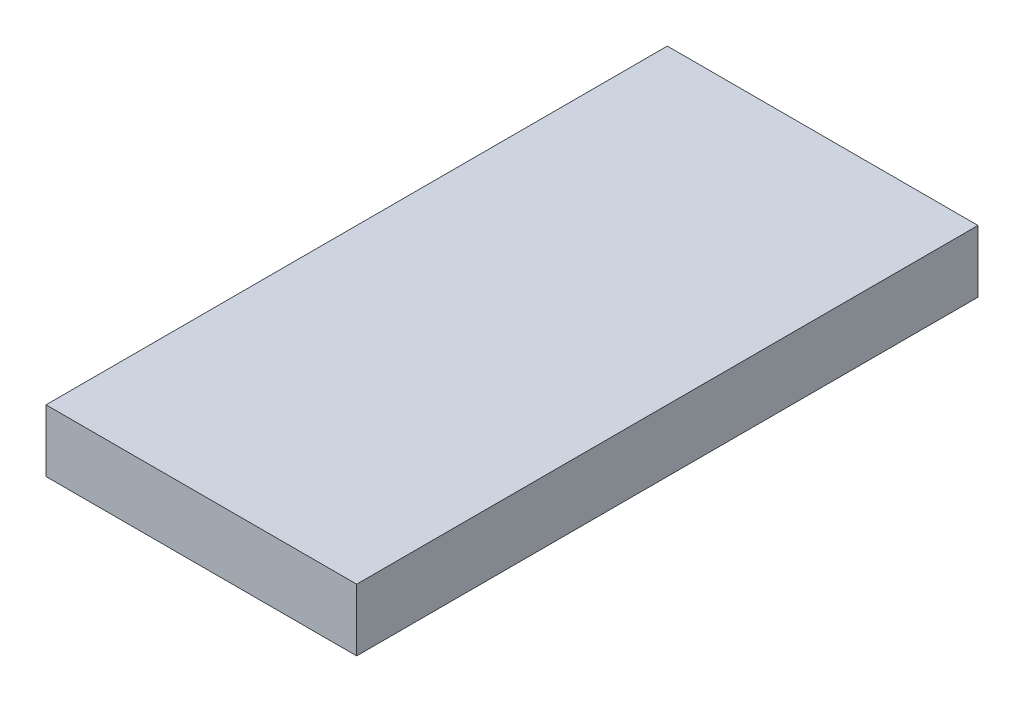
ISO-10303-21;
HEADER;
FILE_DESCRIPTION(('STEP AP214'),'2;1');
FILE_NAME('part.step','',(''),(''),'','','');
FILE_SCHEMA(('AUTOMOTIVE_DESIGN { 1 0 10303 214 1 1 1 1 }'));
ENDSEC;
DATA;
#1=APPLICATION_CONTEXT('core data for automotive mechanical design processes');
#2=APPLICATION_PROTOCOL_DEFINITION('international standard','automotive_design',2000,#1);
#3=PRODUCT_CONTEXT('',#1,'mechanical');
#4=PRODUCT('Part','Part','',(#3));
#5=PRODUCT_RELATED_PRODUCT_CATEGORY('part','',(#4));
#6=PRODUCT_DEFINITION_FORMATION('','',#4);
#7=PRODUCT_DEFINITION_CONTEXT('part definition',#1,'design');
#8=PRODUCT_DEFINITION('design','',#6,#7);
#9=PRODUCT_DEFINITION_SHAPE('','',#8);
#10=(LENGTH_UNIT() NAMED_UNIT(*) SI_UNIT(.MILLI.,.METRE.));
#11=(NAMED_UNIT(*) PLANE_ANGLE_UNIT() SI_UNIT($,.RADIAN.));
#12=(NAMED_UNIT(*) SI_UNIT($,.STERADIAN.) SOLID_ANGLE_UNIT());
#13=UNCERTAINTY_MEASURE_WITH_UNIT(LENGTH_MEASURE(1.E-05),#10,'distance_accuracy_value','');
#14=(GEOMETRIC_REPRESENTATION_CONTEXT(3) GLOBAL_UNCERTAINTY_ASSIGNED_CONTEXT((#13)) GLOBAL_UNIT_ASSIGNED_CONTEXT((#10,
#11,#12)) REPRESENTATION_CONTEXT('',''));
#15=CARTESIAN_POINT('',(0.,0.,0.));
#16=DIRECTION('',(0.,0.,1.));
#17=DIRECTION('',(1.,0.,0.));
#18=AXIS2_PLACEMENT_3D('',#15,#16,#17);
#19=CARTESIAN_POINT('',(10.,2.,20.));
#20=DIRECTION('',(-1.,0.,0.));
#21=DIRECTION('',(0.,0.,1.));
#22=AXIS2_PLACEMENT_3D('',#19,#20,#21);
#23=PLANE('',#22);
#24=DIRECTION('',(0.,0.,-1.));
#25=VECTOR('',#24,1.);
#26=CARTESIAN_POINT('',(10.,-2.,20.));
#27=LINE('',#26,#25);
#28=CARTESIAN_POINT('',(10.,-2.,20.));
#29=VERTEX_POINT('',#28);
#30=CARTESIAN_POINT('',(10.,-2.,-20.));
#31=VERTEX_POINT('',#30);
#32=EDGE_CURVE('E107',#29,#31,#27,.T.);
#33=ORIENTED_EDGE('',*,*,#32,.T.);
#34=DIRECTION('',(0.,-1.,0.));
#35=VECTOR('',#34,1.);
#36=CARTESIAN_POINT('',(10.,2.,-20.));
#37=LINE('',#36,#35);
#38=CARTESIAN_POINT('',(10.,2.,-20.));
#39=VERTEX_POINT('',#38);
#40=EDGE_CURVE('E11',#39,#31,#37,.T.);
#41=ORIENTED_EDGE('',*,*,#40,.F.);
#42=DIRECTION('',(0.,0.,-1.));
#43=VECTOR('',#42,1.);
#44=CARTESIAN_POINT('',(10.,2.,20.));
#45=LINE('',#44,#43);
#46=CARTESIAN_POINT('',(10.,2.,20.));
#47=VERTEX_POINT('',#46);
#48=EDGE_CURVE('E91',#47,#39,#45,.T.);
#49=ORIENTED_EDGE('',*,*,#48,.F.);
#50=DIRECTION('',(0.,-1.,0.));
#51=VECTOR('',#50,1.);
#52=CARTESIAN_POINT('',(10.,2.,20.));
#53=LINE('',#52,#51);
#54=EDGE_CURVE('E103',#47,#29,#53,.T.);
#55=ORIENTED_EDGE('',*,*,#54,.T.);
#56=EDGE_LOOP('',(#33,#41,#49,#55));
#57=FACE_BOUND('',#56,.T.);
#58=ADVANCED_FACE('F39',(#57),#23,.F.);
#59=CARTESIAN_POINT('',(-10.,2.,-20.));
#60=DIRECTION('',(0.,0.,1.));
#61=DIRECTION('',(1.,0.,0.));
#62=AXIS2_PLACEMENT_3D('',#59,#60,#61);
#63=PLANE('',#62);
#64=DIRECTION('',(-1.,0.,0.));
#65=VECTOR('',#64,1.);
#66=CARTESIAN_POINT('',(-10.,-2.,-20.));
#67=LINE('',#66,#65);
#68=CARTESIAN_POINT('',(-10.,-2.,-20.));
#69=VERTEX_POINT('',#68);
#70=EDGE_CURVE('E96',#31,#69,#67,.T.);
#71=ORIENTED_EDGE('',*,*,#70,.T.);
#72=DIRECTION('',(0.,-1.,0.));
#73=VECTOR('',#72,1.);
#74=CARTESIAN_POINT('',(-10.,2.,-20.));
#75=LINE('',#74,#73);
#76=CARTESIAN_POINT('',(-10.,2.,-20.));
#77=VERTEX_POINT('',#76);
#78=EDGE_CURVE('E48',#77,#69,#75,.T.);
#79=ORIENTED_EDGE('',*,*,#78,.F.);
#80=DIRECTION('',(-1.,0.,0.));
#81=VECTOR('',#80,1.);
#82=CARTESIAN_POINT('',(-10.,2.,-20.));
#83=LINE('',#82,#81);
#84=EDGE_CURVE('E86',#39,#77,#83,.T.);
#85=ORIENTED_EDGE('',*,*,#84,.F.);
#86=ORIENTED_EDGE('',*,*,#40,.T.);
#87=EDGE_LOOP('',(#71,#79,#85,#86));
#88=FACE_BOUND('',#87,.T.);
#89=ADVANCED_FACE('F95',(#88),#63,.F.);
#90=CARTESIAN_POINT('',(-9.99999999999999,2.,20.));
#91=DIRECTION('',(1.,0.,0.));
#92=DIRECTION('',(0.,0.,-1.));
#93=AXIS2_PLACEMENT_3D('',#90,#91,#92);
#94=PLANE('',#93);
#95=DIRECTION('',(0.,0.,1.));
#96=VECTOR('',#95,1.);
#97=CARTESIAN_POINT('',(-9.99999999999999,-2.,20.));
#98=LINE('',#97,#96);
#99=CARTESIAN_POINT('',(-9.99999999999999,-2.,20.));
#100=VERTEX_POINT('',#99);
#101=EDGE_CURVE('E73',#69,#100,#98,.T.);
#102=ORIENTED_EDGE('',*,*,#101,.T.);
#103=DIRECTION('',(0.,-1.,0.));
#104=VECTOR('',#103,1.);
#105=CARTESIAN_POINT('',(-9.99999999999999,2.,20.));
#106=LINE('',#105,#104);
#107=CARTESIAN_POINT('',(-9.99999999999999,2.,20.));
#108=VERTEX_POINT('',#107);
#109=EDGE_CURVE('E98',#108,#100,#106,.T.);
#110=ORIENTED_EDGE('',*,*,#109,.F.);
#111=DIRECTION('',(0.,0.,1.));
#112=VECTOR('',#111,1.);
#113=CARTESIAN_POINT('',(-9.99999999999999,2.,20.));
#114=LINE('',#113,#112);
#115=EDGE_CURVE('E89',#77,#108,#114,.T.);
#116=ORIENTED_EDGE('',*,*,#115,.F.);
#117=ORIENTED_EDGE('',*,*,#78,.T.);
#118=EDGE_LOOP('',(#102,#110,#116,#117));
#119=FACE_BOUND('',#118,.T.);
#120=ADVANCED_FACE('F99',(#119),#94,.F.);
#121=CARTESIAN_POINT('',(-9.99999999999999,2.,20.));
#122=DIRECTION('',(0.,0.,-1.));
#123=DIRECTION('',(-1.,0.,0.));
#124=AXIS2_PLACEMENT_3D('',#121,#122,#123);
#125=PLANE('',#124);
#126=DIRECTION('',(1.,0.,0.));
#127=VECTOR('',#126,1.);
#128=CARTESIAN_POINT('',(-9.99999999999999,-2.,20.));
#129=LINE('',#128,#127);
#130=EDGE_CURVE('E79',#100,#29,#129,.T.);
#131=ORIENTED_EDGE('',*,*,#130,.T.);
#132=ORIENTED_EDGE('',*,*,#54,.F.);
#133=DIRECTION('',(1.,0.,0.));
#134=VECTOR('',#133,1.);
#135=CARTESIAN_POINT('',(-9.99999999999999,2.,20.));
#136=LINE('',#135,#134);
#137=EDGE_CURVE('E56',#108,#47,#136,.T.);
#138=ORIENTED_EDGE('',*,*,#137,.F.);
#139=ORIENTED_EDGE('',*,*,#109,.T.);
#140=EDGE_LOOP('',(#131,#132,#138,#139));
#141=FACE_BOUND('',#140,.T.);
#142=ADVANCED_FACE('F120',(#141),#125,.F.);
#143=CARTESIAN_POINT('',(0.,2.,0.));
#144=DIRECTION('',(0.,-1.,0.));
#145=DIRECTION('',(0.,0.,-1.));
#146=AXIS2_PLACEMENT_3D('',#143,#144,#145);
#147=PLANE('',#146);
#148=ORIENTED_EDGE('',*,*,#48,.T.);
#149=ORIENTED_EDGE('',*,*,#84,.T.);
#150=ORIENTED_EDGE('',*,*,#115,.T.);
#151=ORIENTED_EDGE('',*,*,#137,.T.);
#152=EDGE_LOOP('',(#148,#149,#150,#151));
#153=FACE_BOUND('',#152,.T.);
#154=ADVANCED_FACE('F87',(#153),#147,.F.);
#155=CARTESIAN_POINT('',(0.,-2.,0.));
#156=DIRECTION('',(0.,-1.,0.));
#157=DIRECTION('',(0.,0.,-1.));
#158=AXIS2_PLACEMENT_3D('',#155,#156,#157);
#159=PLANE('',#158);
#160=ORIENTED_EDGE('',*,*,#32,.F.);
#161=ORIENTED_EDGE('',*,*,#130,.F.);
#162=ORIENTED_EDGE('',*,*,#101,.F.);
#163=ORIENTED_EDGE('',*,*,#70,.F.);
#164=EDGE_LOOP('',(#160,#161,#162,#163));
#165=FACE_BOUND('',#164,.T.);
#166=ADVANCED_FACE('F123',(#165),#159,.T.);
#167=CLOSED_SHELL('',(#58,#89,#120,#142,#154,#166));
#168=MANIFOLD_SOLID_BREP('B2',#167);
#169=ADVANCED_BREP_SHAPE_REPRESENTATION('',(#18,#168),#14);
#170=SHAPE_DEFINITION_REPRESENTATION(#9,#169);
ENDSEC;
END-ISO-10303-21;
